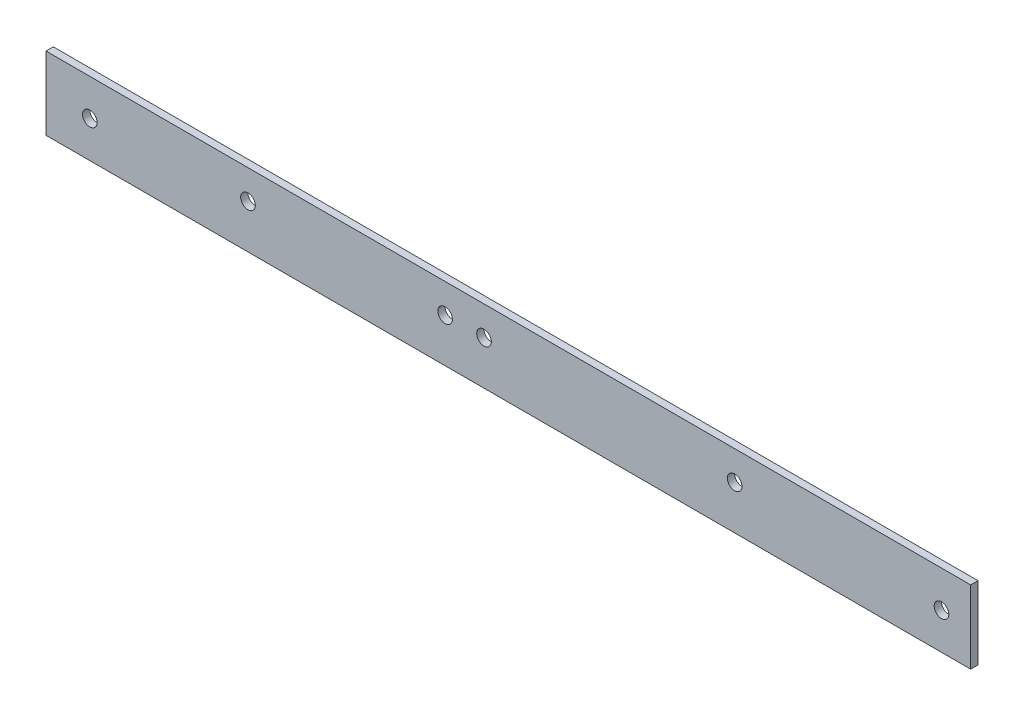
ISO-10303-21;
HEADER;
FILE_DESCRIPTION(('STEP AP214'),'2;1');
FILE_NAME('part.step','',(''),(''),'','','');
FILE_SCHEMA(('AUTOMOTIVE_DESIGN { 1 0 10303 214 1 1 1 1 }'));
ENDSEC;
DATA;
#1=APPLICATION_CONTEXT('core data for automotive mechanical design processes');
#2=APPLICATION_PROTOCOL_DEFINITION('international standard','automotive_design',2000,#1);
#3=PRODUCT_CONTEXT('',#1,'mechanical');
#4=PRODUCT('Part','Part','',(#3));
#5=PRODUCT_RELATED_PRODUCT_CATEGORY('part','',(#4));
#6=PRODUCT_DEFINITION_FORMATION('','',#4);
#7=PRODUCT_DEFINITION_CONTEXT('part definition',#1,'design');
#8=PRODUCT_DEFINITION('design','',#6,#7);
#9=PRODUCT_DEFINITION_SHAPE('','',#8);
#10=(LENGTH_UNIT() NAMED_UNIT(*) SI_UNIT(.MILLI.,.METRE.));
#11=(NAMED_UNIT(*) PLANE_ANGLE_UNIT() SI_UNIT($,.RADIAN.));
#12=(NAMED_UNIT(*) SI_UNIT($,.STERADIAN.) SOLID_ANGLE_UNIT());
#13=UNCERTAINTY_MEASURE_WITH_UNIT(LENGTH_MEASURE(1.E-05),#10,'distance_accuracy_value','');
#14=(GEOMETRIC_REPRESENTATION_CONTEXT(3) GLOBAL_UNCERTAINTY_ASSIGNED_CONTEXT((#13)) GLOBAL_UNIT_ASSIGNED_CONTEXT((#10,
#11,#12)) REPRESENTATION_CONTEXT('',''));
#15=CARTESIAN_POINT('',(0.,0.,0.));
#16=DIRECTION('',(0.,0.,1.));
#17=DIRECTION('',(1.,0.,0.));
#18=AXIS2_PLACEMENT_3D('',#15,#16,#17);
#19=CARTESIAN_POINT('',(-57.8845284850989,7.95357894736842,1.5));
#20=DIRECTION('',(0.,0.,1.));
#21=DIRECTION('',(1.,0.,0.));
#22=AXIS2_PLACEMENT_3D('',#19,#20,#21);
#23=PLANE('',#22);
#24=CARTESIAN_POINT('',(32.1154715149011,16.9535789473684,1.5));
#25=DIRECTION('',(0.,0.,1.));
#26=DIRECTION('',(1.,0.,0.));
#27=AXIS2_PLACEMENT_3D('',#24,#25,#26);
#28=CIRCLE('',#27,1.5);
#29=CARTESIAN_POINT('',(33.6154715149011,16.9535789473684,1.5));
#30=VERTEX_POINT('',#29);
#31=EDGE_CURVE('E131',#30,#30,#28,.T.);
#32=ORIENTED_EDGE('',*,*,#31,.F.);
#33=EDGE_LOOP('',(#32));
#34=FACE_BOUND('',#33,.T.);
#35=CARTESIAN_POINT('',(83.6154715149011,16.9535789473684,1.5));
#36=DIRECTION('',(0.,0.,1.));
#37=DIRECTION('',(1.,0.,0.));
#38=AXIS2_PLACEMENT_3D('',#35,#36,#37);
#39=CIRCLE('',#38,1.5);
#40=CARTESIAN_POINT('',(85.1154715149011,16.9535789473684,1.5));
#41=VERTEX_POINT('',#40);
#42=EDGE_CURVE('E119',#41,#41,#39,.T.);
#43=ORIENTED_EDGE('',*,*,#42,.F.);
#44=EDGE_LOOP('',(#43));
#45=FACE_BOUND('',#44,.T.);
#46=CARTESIAN_POINT('',(126.115471514901,15.4535789473684,1.5));
#47=DIRECTION('',(0.,0.,1.));
#48=DIRECTION('',(1.,0.,0.));
#49=AXIS2_PLACEMENT_3D('',#46,#47,#48);
#50=CIRCLE('',#49,1.5);
#51=CARTESIAN_POINT('',(127.615471514901,15.4535789473684,1.5));
#52=VERTEX_POINT('',#51);
#53=EDGE_CURVE('E98',#52,#52,#50,.T.);
#54=ORIENTED_EDGE('',*,*,#53,.F.);
#55=EDGE_LOOP('',(#54));
#56=FACE_BOUND('',#55,.T.);
#57=DIRECTION('',(0.,-1.,0.));
#58=VECTOR('',#57,1.);
#59=CARTESIAN_POINT('',(-57.8845284850989,22.9535789473684,1.5));
#60=LINE('',#59,#58);
#61=CARTESIAN_POINT('',(-57.8845284850989,22.9535789473684,1.5));
#62=VERTEX_POINT('',#61);
#63=CARTESIAN_POINT('',(-57.8845284850989,7.95357894736842,1.5));
#64=VERTEX_POINT('',#63);
#65=EDGE_CURVE('E83',#62,#64,#60,.T.);
#66=ORIENTED_EDGE('',*,*,#65,.T.);
#67=DIRECTION('',(1.,0.,0.));
#68=VECTOR('',#67,1.);
#69=CARTESIAN_POINT('',(-57.8845284850989,7.95357894736842,1.5));
#70=LINE('',#69,#68);
#71=CARTESIAN_POINT('',(132.115471514901,7.95357894736842,1.5));
#72=VERTEX_POINT('',#71);
#73=EDGE_CURVE('E78',#64,#72,#70,.T.);
#74=ORIENTED_EDGE('',*,*,#73,.T.);
#75=DIRECTION('',(0.,1.,0.));
#76=VECTOR('',#75,1.);
#77=CARTESIAN_POINT('',(132.115471514901,22.9535789473684,1.5));
#78=LINE('',#77,#76);
#79=CARTESIAN_POINT('',(132.115471514901,22.9535789473684,1.5));
#80=VERTEX_POINT('',#79);
#81=EDGE_CURVE('E81',#72,#80,#78,.T.);
#82=ORIENTED_EDGE('',*,*,#81,.T.);
#83=DIRECTION('',(-1.,0.,0.));
#84=VECTOR('',#83,1.);
#85=CARTESIAN_POINT('',(-57.8845284850989,22.9535789473684,1.5));
#86=LINE('',#85,#84);
#87=EDGE_CURVE('E48',#80,#62,#86,.T.);
#88=ORIENTED_EDGE('',*,*,#87,.T.);
#89=EDGE_LOOP('',(#66,#74,#82,#88));
#90=FACE_BOUND('',#89,.T.);
#91=CARTESIAN_POINT('',(-16.3845284850989,16.9535789473684,1.5));
#92=DIRECTION('',(0.,0.,1.));
#93=DIRECTION('',(1.,0.,0.));
#94=AXIS2_PLACEMENT_3D('',#91,#92,#93);
#95=CIRCLE('',#94,1.5);
#96=CARTESIAN_POINT('',(-14.8845284850989,16.9535789473684,1.5));
#97=VERTEX_POINT('',#96);
#98=EDGE_CURVE('E113',#97,#97,#95,.T.);
#99=ORIENTED_EDGE('',*,*,#98,.F.);
#100=EDGE_LOOP('',(#99));
#101=FACE_BOUND('',#100,.T.);
#102=CARTESIAN_POINT('',(-48.8845284850989,15.4535789473684,1.5));
#103=DIRECTION('',(0.,0.,1.));
#104=DIRECTION('',(1.,0.,0.));
#105=AXIS2_PLACEMENT_3D('',#102,#103,#104);
#106=CIRCLE('',#105,1.5);
#107=CARTESIAN_POINT('',(-47.3845284850989,15.4535789473684,1.5));
#108=VERTEX_POINT('',#107);
#109=EDGE_CURVE('E125',#108,#108,#106,.T.);
#110=ORIENTED_EDGE('',*,*,#109,.F.);
#111=EDGE_LOOP('',(#110));
#112=FACE_BOUND('',#111,.T.);
#113=CARTESIAN_POINT('',(24.1154715149011,16.9535789473684,1.5));
#114=DIRECTION('',(0.,0.,1.));
#115=DIRECTION('',(1.,0.,0.));
#116=AXIS2_PLACEMENT_3D('',#113,#114,#115);
#117=CIRCLE('',#116,1.5);
#118=CARTESIAN_POINT('',(25.6154715149011,16.9535789473684,1.5));
#119=VERTEX_POINT('',#118);
#120=EDGE_CURVE('E137',#119,#119,#117,.T.);
#121=ORIENTED_EDGE('',*,*,#120,.F.);
#122=EDGE_LOOP('',(#121));
#123=FACE_BOUND('',#122,.T.);
#124=ADVANCED_FACE('F31',(#34,#45,#56,#90,#101,#112,#123),#23,.T.);
#125=CARTESIAN_POINT('',(-57.8845284850989,7.95357894736842,0.));
#126=DIRECTION('',(0.,0.,1.));
#127=DIRECTION('',(1.,0.,0.));
#128=AXIS2_PLACEMENT_3D('',#125,#126,#127);
#129=PLANE('',#128);
#130=CARTESIAN_POINT('',(32.1154715149011,16.9535789473684,0.));
#131=DIRECTION('',(0.,0.,1.));
#132=DIRECTION('',(1.,0.,0.));
#133=AXIS2_PLACEMENT_3D('',#130,#131,#132);
#134=CIRCLE('',#133,1.5);
#135=CARTESIAN_POINT('',(33.6154715149011,16.9535789473684,0.));
#136=VERTEX_POINT('',#135);
#137=EDGE_CURVE('E134',#136,#136,#134,.T.);
#138=ORIENTED_EDGE('',*,*,#137,.T.);
#139=EDGE_LOOP('',(#138));
#140=FACE_BOUND('',#139,.T.);
#141=CARTESIAN_POINT('',(83.6154715149011,16.9535789473684,0.));
#142=DIRECTION('',(0.,0.,1.));
#143=DIRECTION('',(1.,0.,0.));
#144=AXIS2_PLACEMENT_3D('',#141,#142,#143);
#145=CIRCLE('',#144,1.5);
#146=CARTESIAN_POINT('',(85.1154715149011,16.9535789473684,0.));
#147=VERTEX_POINT('',#146);
#148=EDGE_CURVE('E122',#147,#147,#145,.T.);
#149=ORIENTED_EDGE('',*,*,#148,.T.);
#150=EDGE_LOOP('',(#149));
#151=FACE_BOUND('',#150,.T.);
#152=CARTESIAN_POINT('',(126.115471514901,15.4535789473684,0.));
#153=DIRECTION('',(0.,0.,1.));
#154=DIRECTION('',(1.,0.,0.));
#155=AXIS2_PLACEMENT_3D('',#152,#153,#154);
#156=CIRCLE('',#155,1.5);
#157=CARTESIAN_POINT('',(127.615471514901,15.4535789473684,0.));
#158=VERTEX_POINT('',#157);
#159=EDGE_CURVE('E110',#158,#158,#156,.T.);
#160=ORIENTED_EDGE('',*,*,#159,.T.);
#161=EDGE_LOOP('',(#160));
#162=FACE_BOUND('',#161,.T.);
#163=DIRECTION('',(0.,-1.,0.));
#164=VECTOR('',#163,1.);
#165=CARTESIAN_POINT('',(-57.8845284850989,22.9535789473684,0.));
#166=LINE('',#165,#164);
#167=CARTESIAN_POINT('',(-57.8845284850989,22.9535789473684,0.));
#168=VERTEX_POINT('',#167);
#169=CARTESIAN_POINT('',(-57.8845284850989,7.95357894736842,0.));
#170=VERTEX_POINT('',#169);
#171=EDGE_CURVE('E95',#168,#170,#166,.T.);
#172=ORIENTED_EDGE('',*,*,#171,.F.);
#173=DIRECTION('',(-1.,0.,0.));
#174=VECTOR('',#173,1.);
#175=CARTESIAN_POINT('',(-57.8845284850989,22.9535789473684,0.));
#176=LINE('',#175,#174);
#177=CARTESIAN_POINT('',(132.115471514901,22.9535789473684,0.));
#178=VERTEX_POINT('',#177);
#179=EDGE_CURVE('E71',#178,#168,#176,.T.);
#180=ORIENTED_EDGE('',*,*,#179,.F.);
#181=DIRECTION('',(0.,1.,0.));
#182=VECTOR('',#181,1.);
#183=CARTESIAN_POINT('',(132.115471514901,22.9535789473684,0.));
#184=LINE('',#183,#182);
#185=CARTESIAN_POINT('',(132.115471514901,7.95357894736842,0.));
#186=VERTEX_POINT('',#185);
#187=EDGE_CURVE('E65',#186,#178,#184,.T.);
#188=ORIENTED_EDGE('',*,*,#187,.F.);
#189=DIRECTION('',(1.,0.,0.));
#190=VECTOR('',#189,1.);
#191=CARTESIAN_POINT('',(-57.8845284850989,7.95357894736842,0.));
#192=LINE('',#191,#190);
#193=EDGE_CURVE('E87',#170,#186,#192,.T.);
#194=ORIENTED_EDGE('',*,*,#193,.F.);
#195=EDGE_LOOP('',(#172,#180,#188,#194));
#196=FACE_BOUND('',#195,.T.);
#197=CARTESIAN_POINT('',(-16.3845284850989,16.9535789473684,0.));
#198=DIRECTION('',(0.,0.,1.));
#199=DIRECTION('',(1.,0.,0.));
#200=AXIS2_PLACEMENT_3D('',#197,#198,#199);
#201=CIRCLE('',#200,1.5);
#202=CARTESIAN_POINT('',(-14.8845284850989,16.9535789473684,0.));
#203=VERTEX_POINT('',#202);
#204=EDGE_CURVE('E116',#203,#203,#201,.T.);
#205=ORIENTED_EDGE('',*,*,#204,.T.);
#206=EDGE_LOOP('',(#205));
#207=FACE_BOUND('',#206,.T.);
#208=CARTESIAN_POINT('',(-48.8845284850989,15.4535789473684,0.));
#209=DIRECTION('',(0.,0.,1.));
#210=DIRECTION('',(1.,0.,0.));
#211=AXIS2_PLACEMENT_3D('',#208,#209,#210);
#212=CIRCLE('',#211,1.5);
#213=CARTESIAN_POINT('',(-47.3845284850989,15.4535789473684,0.));
#214=VERTEX_POINT('',#213);
#215=EDGE_CURVE('E128',#214,#214,#212,.T.);
#216=ORIENTED_EDGE('',*,*,#215,.T.);
#217=EDGE_LOOP('',(#216));
#218=FACE_BOUND('',#217,.T.);
#219=CARTESIAN_POINT('',(24.1154715149011,16.9535789473684,0.));
#220=DIRECTION('',(0.,0.,1.));
#221=DIRECTION('',(1.,0.,0.));
#222=AXIS2_PLACEMENT_3D('',#219,#220,#221);
#223=CIRCLE('',#222,1.5);
#224=CARTESIAN_POINT('',(25.6154715149011,16.9535789473684,0.));
#225=VERTEX_POINT('',#224);
#226=EDGE_CURVE('E140',#225,#225,#223,.T.);
#227=ORIENTED_EDGE('',*,*,#226,.T.);
#228=EDGE_LOOP('',(#227));
#229=FACE_BOUND('',#228,.T.);
#230=ADVANCED_FACE('F106',(#140,#151,#162,#196,#207,#218,#229),#129,.F.);
#231=CARTESIAN_POINT('',(-57.8845284850989,22.9535789473684,1.5));
#232=DIRECTION('',(1.,0.,0.));
#233=DIRECTION('',(0.,1.,0.));
#234=AXIS2_PLACEMENT_3D('',#231,#232,#233);
#235=PLANE('',#234);
#236=ORIENTED_EDGE('',*,*,#171,.T.);
#237=DIRECTION('',(0.,0.,-1.));
#238=VECTOR('',#237,1.);
#239=CARTESIAN_POINT('',(-57.8845284850989,7.95357894736842,1.5));
#240=LINE('',#239,#238);
#241=EDGE_CURVE('E11',#64,#170,#240,.T.);
#242=ORIENTED_EDGE('',*,*,#241,.F.);
#243=ORIENTED_EDGE('',*,*,#65,.F.);
#244=DIRECTION('',(0.,0.,-1.));
#245=VECTOR('',#244,1.);
#246=CARTESIAN_POINT('',(-57.8845284850989,22.9535789473684,1.5));
#247=LINE('',#246,#245);
#248=EDGE_CURVE('E91',#62,#168,#247,.T.);
#249=ORIENTED_EDGE('',*,*,#248,.T.);
#250=EDGE_LOOP('',(#236,#242,#243,#249));
#251=FACE_BOUND('',#250,.T.);
#252=ADVANCED_FACE('F33',(#251),#235,.F.);
#253=CARTESIAN_POINT('',(-57.8845284850989,7.95357894736842,1.5));
#254=DIRECTION('',(0.,1.,0.));
#255=DIRECTION('',(0.,0.,1.));
#256=AXIS2_PLACEMENT_3D('',#253,#254,#255);
#257=PLANE('',#256);
#258=ORIENTED_EDGE('',*,*,#193,.T.);
#259=DIRECTION('',(0.,0.,-1.));
#260=VECTOR('',#259,1.);
#261=CARTESIAN_POINT('',(132.115471514901,7.95357894736842,1.5));
#262=LINE('',#261,#260);
#263=EDGE_CURVE('E40',#72,#186,#262,.T.);
#264=ORIENTED_EDGE('',*,*,#263,.F.);
#265=ORIENTED_EDGE('',*,*,#73,.F.);
#266=ORIENTED_EDGE('',*,*,#241,.T.);
#267=EDGE_LOOP('',(#258,#264,#265,#266));
#268=FACE_BOUND('',#267,.T.);
#269=ADVANCED_FACE('F86',(#268),#257,.F.);
#270=CARTESIAN_POINT('',(132.115471514901,22.9535789473684,1.5));
#271=DIRECTION('',(-1.,0.,0.));
#272=DIRECTION('',(0.,0.,1.));
#273=AXIS2_PLACEMENT_3D('',#270,#271,#272);
#274=PLANE('',#273);
#275=ORIENTED_EDGE('',*,*,#187,.T.);
#276=DIRECTION('',(0.,0.,-1.));
#277=VECTOR('',#276,1.);
#278=CARTESIAN_POINT('',(132.115471514901,22.9535789473684,1.5));
#279=LINE('',#278,#277);
#280=EDGE_CURVE('E88',#80,#178,#279,.T.);
#281=ORIENTED_EDGE('',*,*,#280,.F.);
#282=ORIENTED_EDGE('',*,*,#81,.F.);
#283=ORIENTED_EDGE('',*,*,#263,.T.);
#284=EDGE_LOOP('',(#275,#281,#282,#283));
#285=FACE_BOUND('',#284,.T.);
#286=ADVANCED_FACE('F89',(#285),#274,.F.);
#287=CARTESIAN_POINT('',(-57.8845284850989,22.9535789473684,1.5));
#288=DIRECTION('',(0.,-1.,0.));
#289=DIRECTION('',(0.,0.,-1.));
#290=AXIS2_PLACEMENT_3D('',#287,#288,#289);
#291=PLANE('',#290);
#292=ORIENTED_EDGE('',*,*,#179,.T.);
#293=ORIENTED_EDGE('',*,*,#248,.F.);
#294=ORIENTED_EDGE('',*,*,#87,.F.);
#295=ORIENTED_EDGE('',*,*,#280,.T.);
#296=EDGE_LOOP('',(#292,#293,#294,#295));
#297=FACE_BOUND('',#296,.T.);
#298=ADVANCED_FACE('F103',(#297),#291,.F.);
#299=CARTESIAN_POINT('',(126.115471514901,15.4535789473684,1.5));
#300=DIRECTION('',(0.,0.,-1.));
#301=DIRECTION('',(-1.,0.,0.));
#302=AXIS2_PLACEMENT_3D('',#299,#300,#301);
#303=CYLINDRICAL_SURFACE('',#302,1.5);
#304=ORIENTED_EDGE('',*,*,#53,.T.);
#305=EDGE_LOOP('',(#304));
#306=FACE_BOUND('',#305,.T.);
#307=ORIENTED_EDGE('',*,*,#159,.F.);
#308=EDGE_LOOP('',(#307));
#309=FACE_BOUND('',#308,.T.);
#310=ADVANCED_FACE('F160',(#306,#309),#303,.F.);
#311=CARTESIAN_POINT('',(-16.3845284850989,16.9535789473684,1.5));
#312=DIRECTION('',(0.,0.,-1.));
#313=DIRECTION('',(-1.,0.,0.));
#314=AXIS2_PLACEMENT_3D('',#311,#312,#313);
#315=CYLINDRICAL_SURFACE('',#314,1.5);
#316=ORIENTED_EDGE('',*,*,#98,.T.);
#317=EDGE_LOOP('',(#316));
#318=FACE_BOUND('',#317,.T.);
#319=ORIENTED_EDGE('',*,*,#204,.F.);
#320=EDGE_LOOP('',(#319));
#321=FACE_BOUND('',#320,.T.);
#322=ADVANCED_FACE('F206',(#318,#321),#315,.F.);
#323=CARTESIAN_POINT('',(83.6154715149011,16.9535789473684,1.5));
#324=DIRECTION('',(0.,0.,-1.));
#325=DIRECTION('',(-1.,0.,0.));
#326=AXIS2_PLACEMENT_3D('',#323,#324,#325);
#327=CYLINDRICAL_SURFACE('',#326,1.5);
#328=ORIENTED_EDGE('',*,*,#42,.T.);
#329=EDGE_LOOP('',(#328));
#330=FACE_BOUND('',#329,.T.);
#331=ORIENTED_EDGE('',*,*,#148,.F.);
#332=EDGE_LOOP('',(#331));
#333=FACE_BOUND('',#332,.T.);
#334=ADVANCED_FACE('F214',(#330,#333),#327,.F.);
#335=CARTESIAN_POINT('',(-48.8845284850989,15.4535789473684,1.5));
#336=DIRECTION('',(0.,0.,-1.));
#337=DIRECTION('',(-1.,0.,0.));
#338=AXIS2_PLACEMENT_3D('',#335,#336,#337);
#339=CYLINDRICAL_SURFACE('',#338,1.5);
#340=ORIENTED_EDGE('',*,*,#109,.T.);
#341=EDGE_LOOP('',(#340));
#342=FACE_BOUND('',#341,.T.);
#343=ORIENTED_EDGE('',*,*,#215,.F.);
#344=EDGE_LOOP('',(#343));
#345=FACE_BOUND('',#344,.T.);
#346=ADVANCED_FACE('F222',(#342,#345),#339,.F.);
#347=CARTESIAN_POINT('',(32.1154715149011,16.9535789473684,1.5));
#348=DIRECTION('',(0.,0.,-1.));
#349=DIRECTION('',(-1.,0.,0.));
#350=AXIS2_PLACEMENT_3D('',#347,#348,#349);
#351=CYLINDRICAL_SURFACE('',#350,1.5);
#352=ORIENTED_EDGE('',*,*,#31,.T.);
#353=EDGE_LOOP('',(#352));
#354=FACE_BOUND('',#353,.T.);
#355=ORIENTED_EDGE('',*,*,#137,.F.);
#356=EDGE_LOOP('',(#355));
#357=FACE_BOUND('',#356,.T.);
#358=ADVANCED_FACE('F231',(#354,#357),#351,.F.);
#359=CARTESIAN_POINT('',(24.1154715149011,16.9535789473684,1.5));
#360=DIRECTION('',(0.,0.,-1.));
#361=DIRECTION('',(-1.,0.,0.));
#362=AXIS2_PLACEMENT_3D('',#359,#360,#361);
#363=CYLINDRICAL_SURFACE('',#362,1.5);
#364=ORIENTED_EDGE('',*,*,#120,.T.);
#365=EDGE_LOOP('',(#364));
#366=FACE_BOUND('',#365,.T.);
#367=ORIENTED_EDGE('',*,*,#226,.F.);
#368=EDGE_LOOP('',(#367));
#369=FACE_BOUND('',#368,.T.);
#370=ADVANCED_FACE('F146',(#366,#369),#363,.F.);
#371=CLOSED_SHELL('',(#124,#230,#252,#269,#286,#298,#310,#322,#334,#346,#358,#370));
#372=MANIFOLD_SOLID_BREP('B2',#371);
#373=ADVANCED_BREP_SHAPE_REPRESENTATION('',(#18,#372),#14);
#374=SHAPE_DEFINITION_REPRESENTATION(#9,#373);
ENDSEC;
END-ISO-10303-21;
